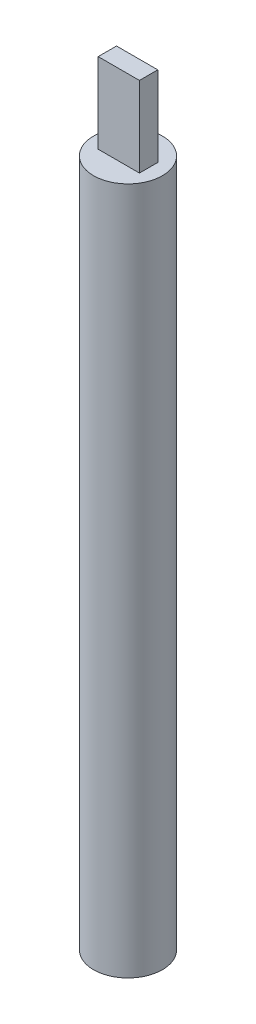
ISO-10303-21;
HEADER;
FILE_DESCRIPTION(('STEP AP214'),'2;1');
FILE_NAME('part.step','',(''),(''),'','','');
FILE_SCHEMA(('AUTOMOTIVE_DESIGN { 1 0 10303 214 1 1 1 1 }'));
ENDSEC;
DATA;
#1=APPLICATION_CONTEXT('core data for automotive mechanical design processes');
#2=APPLICATION_PROTOCOL_DEFINITION('international standard','automotive_design',2000,#1);
#3=PRODUCT_CONTEXT('',#1,'mechanical');
#4=PRODUCT('Part','Part','',(#3));
#5=PRODUCT_RELATED_PRODUCT_CATEGORY('part','',(#4));
#6=PRODUCT_DEFINITION_FORMATION('','',#4);
#7=PRODUCT_DEFINITION_CONTEXT('part definition',#1,'design');
#8=PRODUCT_DEFINITION('design','',#6,#7);
#9=PRODUCT_DEFINITION_SHAPE('','',#8);
#10=(LENGTH_UNIT() NAMED_UNIT(*) SI_UNIT(.MILLI.,.METRE.));
#11=(NAMED_UNIT(*) PLANE_ANGLE_UNIT() SI_UNIT($,.RADIAN.));
#12=(NAMED_UNIT(*) SI_UNIT($,.STERADIAN.) SOLID_ANGLE_UNIT());
#13=UNCERTAINTY_MEASURE_WITH_UNIT(LENGTH_MEASURE(1.E-05),#10,'distance_accuracy_value','');
#14=(GEOMETRIC_REPRESENTATION_CONTEXT(3) GLOBAL_UNCERTAINTY_ASSIGNED_CONTEXT((#13)) GLOBAL_UNIT_ASSIGNED_CONTEXT((#10,
#11,#12)) REPRESENTATION_CONTEXT('',''));
#15=CARTESIAN_POINT('',(0.,0.,0.));
#16=DIRECTION('',(0.,0.,1.));
#17=DIRECTION('',(1.,0.,0.));
#18=AXIS2_PLACEMENT_3D('',#15,#16,#17);
#19=CARTESIAN_POINT('',(0.,300.,0.));
#20=DIRECTION('',(0.,-1.,0.));
#21=DIRECTION('',(0.,0.,-1.));
#22=AXIS2_PLACEMENT_3D('',#19,#20,#21);
#23=CYLINDRICAL_SURFACE('',#22,15.);
#24=CARTESIAN_POINT('',(0.,300.,0.));
#25=DIRECTION('',(0.,1.,0.));
#26=DIRECTION('',(0.,0.,1.));
#27=AXIS2_PLACEMENT_3D('',#24,#25,#26);
#28=CIRCLE('',#27,15.);
#29=CARTESIAN_POINT('',(0.,300.,15.));
#30=VERTEX_POINT('',#29);
#31=EDGE_CURVE('E11',#30,#30,#28,.T.);
#32=ORIENTED_EDGE('',*,*,#31,.F.);
#33=EDGE_LOOP('',(#32));
#34=FACE_BOUND('',#33,.T.);
#35=CARTESIAN_POINT('',(0.,0.,0.));
#36=DIRECTION('',(0.,1.,0.));
#37=DIRECTION('',(0.,0.,1.));
#38=AXIS2_PLACEMENT_3D('',#35,#36,#37);
#39=CIRCLE('',#38,15.);
#40=CARTESIAN_POINT('',(0.,0.,15.));
#41=VERTEX_POINT('',#40);
#42=EDGE_CURVE('E36',#41,#41,#39,.T.);
#43=ORIENTED_EDGE('',*,*,#42,.T.);
#44=EDGE_LOOP('',(#43));
#45=FACE_BOUND('',#44,.T.);
#46=ADVANCED_FACE('F33',(#34,#45),#23,.T.);
#47=CARTESIAN_POINT('',(0.,300.,0.));
#48=DIRECTION('',(0.,1.,0.));
#49=DIRECTION('',(0.,0.,1.));
#50=AXIS2_PLACEMENT_3D('',#47,#48,#49);
#51=PLANE('',#50);
#52=DIRECTION('',(0.,0.,1.));
#53=VECTOR('',#52,1.);
#54=CARTESIAN_POINT('',(-9.,300.,4.));
#55=LINE('',#54,#53);
#56=CARTESIAN_POINT('',(-9.,300.,-4.));
#57=VERTEX_POINT('',#56);
#58=CARTESIAN_POINT('',(-9.,300.,4.));
#59=VERTEX_POINT('',#58);
#60=EDGE_CURVE('E47',#57,#59,#55,.T.);
#61=ORIENTED_EDGE('',*,*,#60,.F.);
#62=DIRECTION('',(-1.,0.,0.));
#63=VECTOR('',#62,1.);
#64=CARTESIAN_POINT('',(9.,300.,-4.));
#65=LINE('',#64,#63);
#66=CARTESIAN_POINT('',(9.,300.,-4.));
#67=VERTEX_POINT('',#66);
#68=EDGE_CURVE('E51',#67,#57,#65,.T.);
#69=ORIENTED_EDGE('',*,*,#68,.F.);
#70=DIRECTION('',(0.,0.,-1.));
#71=VECTOR('',#70,1.);
#72=CARTESIAN_POINT('',(9.,300.,4.));
#73=LINE('',#72,#71);
#74=CARTESIAN_POINT('',(9.,300.,4.));
#75=VERTEX_POINT('',#74);
#76=EDGE_CURVE('E103',#75,#67,#73,.T.);
#77=ORIENTED_EDGE('',*,*,#76,.F.);
#78=DIRECTION('',(1.,0.,0.));
#79=VECTOR('',#78,1.);
#80=CARTESIAN_POINT('',(9.,300.,4.));
#81=LINE('',#80,#79);
#82=EDGE_CURVE('E105',#59,#75,#81,.T.);
#83=ORIENTED_EDGE('',*,*,#82,.F.);
#84=EDGE_LOOP('',(#61,#69,#77,#83));
#85=FACE_BOUND('',#84,.T.);
#86=ORIENTED_EDGE('',*,*,#31,.T.);
#87=EDGE_LOOP('',(#86));
#88=FACE_BOUND('',#87,.T.);
#89=ADVANCED_FACE('F123',(#85,#88),#51,.T.);
#90=CARTESIAN_POINT('',(0.,0.,0.));
#91=DIRECTION('',(0.,1.,0.));
#92=DIRECTION('',(0.,0.,1.));
#93=AXIS2_PLACEMENT_3D('',#90,#91,#92);
#94=PLANE('',#93);
#95=ORIENTED_EDGE('',*,*,#42,.F.);
#96=EDGE_LOOP('',(#95));
#97=FACE_BOUND('',#96,.T.);
#98=ADVANCED_FACE('F128',(#97),#94,.F.);
#99=CARTESIAN_POINT('',(-9.,335.,4.));
#100=DIRECTION('',(1.,0.,0.));
#101=DIRECTION('',(0.,0.,-1.));
#102=AXIS2_PLACEMENT_3D('',#99,#100,#101);
#103=PLANE('',#102);
#104=ORIENTED_EDGE('',*,*,#60,.T.);
#105=DIRECTION('',(0.,-1.,0.));
#106=VECTOR('',#105,1.);
#107=CARTESIAN_POINT('',(-9.,335.,4.));
#108=LINE('',#107,#106);
#109=CARTESIAN_POINT('',(-9.,335.,4.));
#110=VERTEX_POINT('',#109);
#111=EDGE_CURVE('E76',#110,#59,#108,.T.);
#112=ORIENTED_EDGE('',*,*,#111,.F.);
#113=DIRECTION('',(0.,0.,1.));
#114=VECTOR('',#113,1.);
#115=CARTESIAN_POINT('',(-9.,335.,4.));
#116=LINE('',#115,#114);
#117=CARTESIAN_POINT('',(-9.,335.,-4.));
#118=VERTEX_POINT('',#117);
#119=EDGE_CURVE('E82',#118,#110,#116,.T.);
#120=ORIENTED_EDGE('',*,*,#119,.F.);
#121=DIRECTION('',(0.,-1.,0.));
#122=VECTOR('',#121,1.);
#123=CARTESIAN_POINT('',(-9.,335.,-4.));
#124=LINE('',#123,#122);
#125=EDGE_CURVE('E100',#118,#57,#124,.T.);
#126=ORIENTED_EDGE('',*,*,#125,.T.);
#127=EDGE_LOOP('',(#104,#112,#120,#126));
#128=FACE_BOUND('',#127,.T.);
#129=ADVANCED_FACE('F92',(#128),#103,.F.);
#130=CARTESIAN_POINT('',(9.,335.,4.));
#131=DIRECTION('',(0.,0.,-1.));
#132=DIRECTION('',(-1.,0.,0.));
#133=AXIS2_PLACEMENT_3D('',#130,#131,#132);
#134=PLANE('',#133);
#135=ORIENTED_EDGE('',*,*,#82,.T.);
#136=DIRECTION('',(0.,-1.,0.));
#137=VECTOR('',#136,1.);
#138=CARTESIAN_POINT('',(9.,335.,4.));
#139=LINE('',#138,#137);
#140=CARTESIAN_POINT('',(9.,335.,4.));
#141=VERTEX_POINT('',#140);
#142=EDGE_CURVE('E78',#141,#75,#139,.T.);
#143=ORIENTED_EDGE('',*,*,#142,.F.);
#144=DIRECTION('',(1.,0.,0.));
#145=VECTOR('',#144,1.);
#146=CARTESIAN_POINT('',(9.,335.,4.));
#147=LINE('',#146,#145);
#148=EDGE_CURVE('E71',#110,#141,#147,.T.);
#149=ORIENTED_EDGE('',*,*,#148,.F.);
#150=ORIENTED_EDGE('',*,*,#111,.T.);
#151=EDGE_LOOP('',(#135,#143,#149,#150));
#152=FACE_BOUND('',#151,.T.);
#153=ADVANCED_FACE('F74',(#152),#134,.F.);
#154=CARTESIAN_POINT('',(9.,335.,4.));
#155=DIRECTION('',(-1.,0.,0.));
#156=DIRECTION('',(0.,0.,1.));
#157=AXIS2_PLACEMENT_3D('',#154,#155,#156);
#158=PLANE('',#157);
#159=ORIENTED_EDGE('',*,*,#76,.T.);
#160=DIRECTION('',(0.,-1.,0.));
#161=VECTOR('',#160,1.);
#162=CARTESIAN_POINT('',(9.,335.,-4.));
#163=LINE('',#162,#161);
#164=CARTESIAN_POINT('',(9.,335.,-4.));
#165=VERTEX_POINT('',#164);
#166=EDGE_CURVE('E95',#165,#67,#163,.T.);
#167=ORIENTED_EDGE('',*,*,#166,.F.);
#168=DIRECTION('',(0.,0.,-1.));
#169=VECTOR('',#168,1.);
#170=CARTESIAN_POINT('',(9.,335.,4.));
#171=LINE('',#170,#169);
#172=EDGE_CURVE('E81',#141,#165,#171,.T.);
#173=ORIENTED_EDGE('',*,*,#172,.F.);
#174=ORIENTED_EDGE('',*,*,#142,.T.);
#175=EDGE_LOOP('',(#159,#167,#173,#174));
#176=FACE_BOUND('',#175,.T.);
#177=ADVANCED_FACE('F111',(#176),#158,.F.);
#178=CARTESIAN_POINT('',(9.,335.,-4.));
#179=DIRECTION('',(0.,0.,1.));
#180=DIRECTION('',(1.,0.,0.));
#181=AXIS2_PLACEMENT_3D('',#178,#179,#180);
#182=PLANE('',#181);
#183=ORIENTED_EDGE('',*,*,#68,.T.);
#184=ORIENTED_EDGE('',*,*,#125,.F.);
#185=DIRECTION('',(-1.,0.,0.));
#186=VECTOR('',#185,1.);
#187=CARTESIAN_POINT('',(9.,335.,-4.));
#188=LINE('',#187,#186);
#189=EDGE_CURVE('E87',#165,#118,#188,.T.);
#190=ORIENTED_EDGE('',*,*,#189,.F.);
#191=ORIENTED_EDGE('',*,*,#166,.T.);
#192=EDGE_LOOP('',(#183,#184,#190,#191));
#193=FACE_BOUND('',#192,.T.);
#194=ADVANCED_FACE('F113',(#193),#182,.F.);
#195=CARTESIAN_POINT('',(0.,335.,0.));
#196=DIRECTION('',(0.,1.,0.));
#197=DIRECTION('',(0.,0.,1.));
#198=AXIS2_PLACEMENT_3D('',#195,#196,#197);
#199=PLANE('',#198);
#200=ORIENTED_EDGE('',*,*,#119,.T.);
#201=ORIENTED_EDGE('',*,*,#148,.T.);
#202=ORIENTED_EDGE('',*,*,#172,.T.);
#203=ORIENTED_EDGE('',*,*,#189,.T.);
#204=EDGE_LOOP('',(#200,#201,#202,#203));
#205=FACE_BOUND('',#204,.T.);
#206=ADVANCED_FACE('F85',(#205),#199,.T.);
#207=CLOSED_SHELL('',(#46,#89,#98,#129,#153,#177,#194,#206));
#208=MANIFOLD_SOLID_BREP('B2',#207);
#209=ADVANCED_BREP_SHAPE_REPRESENTATION('',(#18,#208),#14);
#210=SHAPE_DEFINITION_REPRESENTATION(#9,#209);
ENDSEC;
END-ISO-10303-21;
